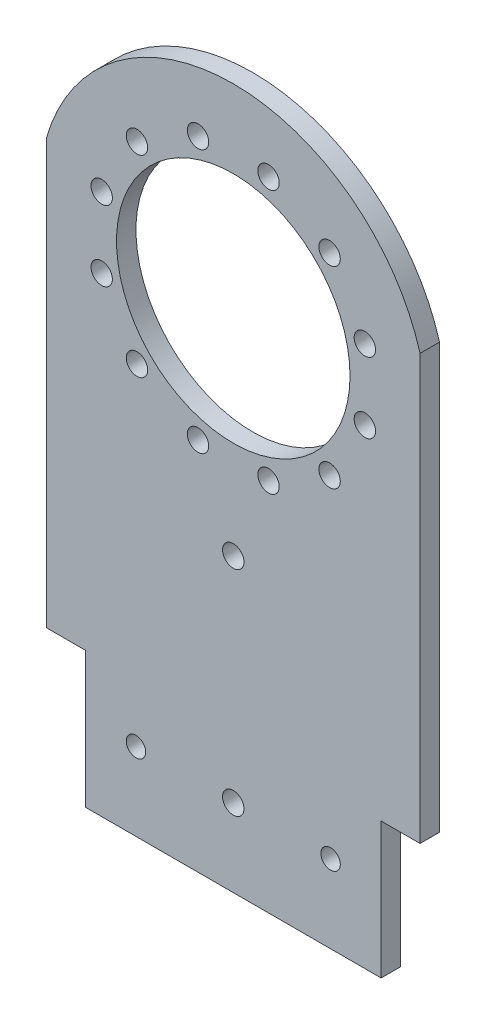
ISO-10303-21;
HEADER;
FILE_DESCRIPTION(('STEP AP214'),'2;1');
FILE_NAME('part.step','',(''),(''),'','','');
FILE_SCHEMA(('AUTOMOTIVE_DESIGN { 1 0 10303 214 1 1 1 1 }'));
ENDSEC;
DATA;
#1=APPLICATION_CONTEXT('core data for automotive mechanical design processes');
#2=APPLICATION_PROTOCOL_DEFINITION('international standard','automotive_design',2000,#1);
#3=PRODUCT_CONTEXT('',#1,'mechanical');
#4=PRODUCT('Part','Part','',(#3));
#5=PRODUCT_RELATED_PRODUCT_CATEGORY('part','',(#4));
#6=PRODUCT_DEFINITION_FORMATION('','',#4);
#7=PRODUCT_DEFINITION_CONTEXT('part definition',#1,'design');
#8=PRODUCT_DEFINITION('design','',#6,#7);
#9=PRODUCT_DEFINITION_SHAPE('','',#8);
#10=(LENGTH_UNIT() NAMED_UNIT(*) SI_UNIT(.MILLI.,.METRE.));
#11=(NAMED_UNIT(*) PLANE_ANGLE_UNIT() SI_UNIT($,.RADIAN.));
#12=(NAMED_UNIT(*) SI_UNIT($,.STERADIAN.) SOLID_ANGLE_UNIT());
#13=UNCERTAINTY_MEASURE_WITH_UNIT(LENGTH_MEASURE(1.E-05),#10,'distance_accuracy_value','');
#14=(GEOMETRIC_REPRESENTATION_CONTEXT(3) GLOBAL_UNCERTAINTY_ASSIGNED_CONTEXT((#13)) GLOBAL_UNIT_ASSIGNED_CONTEXT((#10,
#11,#12)) REPRESENTATION_CONTEXT('',''));
#15=CARTESIAN_POINT('',(0.,0.,0.));
#16=DIRECTION('',(0.,0.,1.));
#17=DIRECTION('',(1.,0.,0.));
#18=AXIS2_PLACEMENT_3D('',#15,#16,#17);
#19=CARTESIAN_POINT('',(-48.,0.,5.));
#20=DIRECTION('',(0.,1.,0.));
#21=DIRECTION('',(0.,0.,1.));
#22=AXIS2_PLACEMENT_3D('',#19,#20,#21);
#23=PLANE('',#22);
#24=DIRECTION('',(0.,0.,1.));
#25=VECTOR('',#24,1.);
#26=CARTESIAN_POINT('',(38.,0.,-83.6427217395513));
#27=LINE('',#26,#25);
#28=CARTESIAN_POINT('',(38.,0.,0.));
#29=VERTEX_POINT('',#28);
#30=CARTESIAN_POINT('',(38.,0.,5.));
#31=VERTEX_POINT('',#30);
#32=EDGE_CURVE('E60',#29,#31,#27,.T.);
#33=ORIENTED_EDGE('',*,*,#32,.F.);
#34=DIRECTION('',(1.,0.,0.));
#35=VECTOR('',#34,1.);
#36=CARTESIAN_POINT('',(-48.,0.,0.));
#37=LINE('',#36,#35);
#38=CARTESIAN_POINT('',(48.,0.,0.));
#39=VERTEX_POINT('',#38);
#40=EDGE_CURVE('E209',#29,#39,#37,.T.);
#41=ORIENTED_EDGE('',*,*,#40,.T.);
#42=DIRECTION('',(0.,0.,-1.));
#43=VECTOR('',#42,1.);
#44=CARTESIAN_POINT('',(48.,0.,5.));
#45=LINE('',#44,#43);
#46=CARTESIAN_POINT('',(48.,0.,5.));
#47=VERTEX_POINT('',#46);
#48=EDGE_CURVE('E202',#47,#39,#45,.T.);
#49=ORIENTED_EDGE('',*,*,#48,.F.);
#50=DIRECTION('',(1.,0.,0.));
#51=VECTOR('',#50,1.);
#52=CARTESIAN_POINT('',(-48.,0.,5.));
#53=LINE('',#52,#51);
#54=EDGE_CURVE('E200',#31,#47,#53,.T.);
#55=ORIENTED_EDGE('',*,*,#54,.F.);
#56=EDGE_LOOP('',(#33,#41,#49,#55));
#57=FACE_BOUND('',#56,.T.);
#58=ADVANCED_FACE('F35',(#57),#23,.F.);
#59=CARTESIAN_POINT('',(0.,95.07,5.));
#60=DIRECTION('',(0.,0.,1.));
#61=DIRECTION('',(1.,0.,0.));
#62=AXIS2_PLACEMENT_3D('',#59,#60,#61);
#63=PLANE('',#62);
#64=CARTESIAN_POINT('',(24.7487373415292,119.818737341529,5.));
#65=DIRECTION('',(0.,0.,1.));
#66=DIRECTION('',(1.,0.,0.));
#67=AXIS2_PLACEMENT_3D('',#64,#65,#66);
#68=CIRCLE('',#67,2.75);
#69=CARTESIAN_POINT('',(27.4987373415292,119.818737341529,5.));
#70=VERTEX_POINT('',#69);
#71=EDGE_CURVE('E155',#70,#70,#68,.T.);
#72=ORIENTED_EDGE('',*,*,#71,.F.);
#73=EDGE_LOOP('',(#72));
#74=FACE_BOUND('',#73,.T.);
#75=CARTESIAN_POINT('',(33.8074039201174,104.128666578588,5.));
#76=DIRECTION('',(0.,0.,1.));
#77=DIRECTION('',(1.,0.,0.));
#78=AXIS2_PLACEMENT_3D('',#75,#76,#77);
#79=CIRCLE('',#78,2.75);
#80=CARTESIAN_POINT('',(36.5574039201174,104.128666578588,5.));
#81=VERTEX_POINT('',#80);
#82=EDGE_CURVE('E159',#81,#81,#79,.T.);
#83=ORIENTED_EDGE('',*,*,#82,.F.);
#84=EDGE_LOOP('',(#83));
#85=FACE_BOUND('',#84,.T.);
#86=CARTESIAN_POINT('',(33.8074039201174,86.0113334214117,5.));
#87=DIRECTION('',(0.,0.,1.));
#88=DIRECTION('',(1.,0.,0.));
#89=AXIS2_PLACEMENT_3D('',#86,#87,#88);
#90=CIRCLE('',#89,2.75);
#91=CARTESIAN_POINT('',(36.5574039201174,86.0113334214117,5.));
#92=VERTEX_POINT('',#91);
#93=EDGE_CURVE('E162',#92,#92,#90,.T.);
#94=ORIENTED_EDGE('',*,*,#93,.F.);
#95=EDGE_LOOP('',(#94));
#96=FACE_BOUND('',#95,.T.);
#97=CARTESIAN_POINT('',(24.7487373415292,70.3212626584708,5.));
#98=DIRECTION('',(0.,0.,1.));
#99=DIRECTION('',(1.,0.,0.));
#100=AXIS2_PLACEMENT_3D('',#97,#98,#99);
#101=CIRCLE('',#100,2.74999999999999);
#102=CARTESIAN_POINT('',(27.4987373415291,70.3212626584708,5.));
#103=VERTEX_POINT('',#102);
#104=EDGE_CURVE('E165',#103,#103,#101,.T.);
#105=ORIENTED_EDGE('',*,*,#104,.F.);
#106=EDGE_LOOP('',(#105));
#107=FACE_BOUND('',#106,.T.);
#108=CARTESIAN_POINT('',(9.05866657858823,61.2625960798826,5.));
#109=DIRECTION('',(0.,0.,1.));
#110=DIRECTION('',(1.,0.,0.));
#111=AXIS2_PLACEMENT_3D('',#108,#109,#110);
#112=CIRCLE('',#111,2.74999999999999);
#113=CARTESIAN_POINT('',(11.8086665785882,61.2625960798826,5.));
#114=VERTEX_POINT('',#113);
#115=EDGE_CURVE('E168',#114,#114,#112,.T.);
#116=ORIENTED_EDGE('',*,*,#115,.F.);
#117=EDGE_LOOP('',(#116));
#118=FACE_BOUND('',#117,.T.);
#119=CARTESIAN_POINT('',(-9.05866657858824,61.2625960798826,5.));
#120=DIRECTION('',(0.,0.,1.));
#121=DIRECTION('',(1.,0.,0.));
#122=AXIS2_PLACEMENT_3D('',#119,#120,#121);
#123=CIRCLE('',#122,2.75);
#124=CARTESIAN_POINT('',(-6.30866657858825,61.2625960798826,5.));
#125=VERTEX_POINT('',#124);
#126=EDGE_CURVE('E171',#125,#125,#123,.T.);
#127=ORIENTED_EDGE('',*,*,#126,.F.);
#128=EDGE_LOOP('',(#127));
#129=FACE_BOUND('',#128,.T.);
#130=CARTESIAN_POINT('',(-24.7487373415292,70.3212626584708,5.));
#131=DIRECTION('',(0.,0.,1.));
#132=DIRECTION('',(1.,0.,0.));
#133=AXIS2_PLACEMENT_3D('',#130,#131,#132);
#134=CIRCLE('',#133,2.75);
#135=CARTESIAN_POINT('',(-21.9987373415292,70.3212626584708,5.));
#136=VERTEX_POINT('',#135);
#137=EDGE_CURVE('E174',#136,#136,#134,.T.);
#138=ORIENTED_EDGE('',*,*,#137,.F.);
#139=EDGE_LOOP('',(#138));
#140=FACE_BOUND('',#139,.T.);
#141=CARTESIAN_POINT('',(-33.8074039201174,86.0113334214118,5.));
#142=DIRECTION('',(0.,0.,1.));
#143=DIRECTION('',(1.,0.,0.));
#144=AXIS2_PLACEMENT_3D('',#141,#142,#143);
#145=CIRCLE('',#144,2.74999999999999);
#146=CARTESIAN_POINT('',(-31.0574039201174,86.0113334214118,5.));
#147=VERTEX_POINT('',#146);
#148=EDGE_CURVE('E148',#147,#147,#145,.T.);
#149=ORIENTED_EDGE('',*,*,#148,.F.);
#150=EDGE_LOOP('',(#149));
#151=FACE_BOUND('',#150,.T.);
#152=CARTESIAN_POINT('',(-33.8074039201174,104.128666578588,5.));
#153=DIRECTION('',(0.,0.,1.));
#154=DIRECTION('',(1.,0.,0.));
#155=AXIS2_PLACEMENT_3D('',#152,#153,#154);
#156=CIRCLE('',#155,2.75);
#157=CARTESIAN_POINT('',(-31.0574039201174,104.128666578588,5.));
#158=VERTEX_POINT('',#157);
#159=EDGE_CURVE('E145',#158,#158,#156,.T.);
#160=ORIENTED_EDGE('',*,*,#159,.F.);
#161=EDGE_LOOP('',(#160));
#162=FACE_BOUND('',#161,.T.);
#163=CARTESIAN_POINT('',(-24.7487373415292,119.818737341529,5.));
#164=DIRECTION('',(0.,0.,1.));
#165=DIRECTION('',(1.,0.,0.));
#166=AXIS2_PLACEMENT_3D('',#163,#164,#165);
#167=CIRCLE('',#166,2.74999999999999);
#168=CARTESIAN_POINT('',(-21.9987373415292,119.818737341529,5.));
#169=VERTEX_POINT('',#168);
#170=EDGE_CURVE('E149',#169,#169,#167,.T.);
#171=ORIENTED_EDGE('',*,*,#170,.F.);
#172=EDGE_LOOP('',(#171));
#173=FACE_BOUND('',#172,.T.);
#174=CARTESIAN_POINT('',(-9.05866657858823,128.877403920117,5.));
#175=DIRECTION('',(0.,0.,1.));
#176=DIRECTION('',(1.,0.,0.));
#177=AXIS2_PLACEMENT_3D('',#174,#175,#176);
#178=CIRCLE('',#177,2.75);
#179=CARTESIAN_POINT('',(-6.30866657858823,128.877403920117,5.));
#180=VERTEX_POINT('',#179);
#181=EDGE_CURVE('E152',#180,#180,#178,.T.);
#182=ORIENTED_EDGE('',*,*,#181,.F.);
#183=EDGE_LOOP('',(#182));
#184=FACE_BOUND('',#183,.T.);
#185=CARTESIAN_POINT('',(9.05866657858825,128.877403920117,5.));
#186=DIRECTION('',(0.,0.,1.));
#187=DIRECTION('',(1.,0.,0.));
#188=AXIS2_PLACEMENT_3D('',#185,#186,#187);
#189=CIRCLE('',#188,2.75);
#190=CARTESIAN_POINT('',(11.8086665785882,128.877403920117,5.));
#191=VERTEX_POINT('',#190);
#192=EDGE_CURVE('E158',#191,#191,#189,.T.);
#193=ORIENTED_EDGE('',*,*,#192,.F.);
#194=EDGE_LOOP('',(#193));
#195=FACE_BOUND('',#194,.T.);
#196=CARTESIAN_POINT('',(0.,40.,5.));
#197=DIRECTION('',(0.,0.,1.));
#198=DIRECTION('',(1.,0.,0.));
#199=AXIS2_PLACEMENT_3D('',#196,#197,#198);
#200=CIRCLE('',#199,2.75);
#201=CARTESIAN_POINT('',(2.75,40.,5.));
#202=VERTEX_POINT('',#201);
#203=EDGE_CURVE('E182',#202,#202,#200,.T.);
#204=ORIENTED_EDGE('',*,*,#203,.F.);
#205=EDGE_LOOP('',(#204));
#206=FACE_BOUND('',#205,.T.);
#207=DIRECTION('',(0.,1.,0.));
#208=VECTOR('',#207,1.);
#209=CARTESIAN_POINT('',(48.,109.07,5.));
#210=LINE('',#209,#208);
#211=CARTESIAN_POINT('',(48.,109.07,5.));
#212=VERTEX_POINT('',#211);
#213=EDGE_CURVE('E193',#47,#212,#210,.T.);
#214=ORIENTED_EDGE('',*,*,#213,.T.);
#215=CARTESIAN_POINT('',(0.,95.07,5.));
#216=DIRECTION('',(0.,0.,1.));
#217=DIRECTION('',(1.,0.,0.));
#218=AXIS2_PLACEMENT_3D('',#215,#216,#217);
#219=CIRCLE('',#218,50.);
#220=CARTESIAN_POINT('',(-48.,109.07,5.));
#221=VERTEX_POINT('',#220);
#222=EDGE_CURVE('E195',#212,#221,#219,.T.);
#223=ORIENTED_EDGE('',*,*,#222,.T.);
#224=DIRECTION('',(0.,-1.,0.));
#225=VECTOR('',#224,1.);
#226=CARTESIAN_POINT('',(-48.,109.07,5.));
#227=LINE('',#226,#225);
#228=CARTESIAN_POINT('',(-48.,0.,5.));
#229=VERTEX_POINT('',#228);
#230=EDGE_CURVE('E198',#221,#229,#227,.T.);
#231=ORIENTED_EDGE('',*,*,#230,.T.);
#232=CARTESIAN_POINT('',(-38.,0.,5.));
#233=VERTEX_POINT('',#232);
#234=EDGE_CURVE('E127',#229,#233,#53,.T.);
#235=ORIENTED_EDGE('',*,*,#234,.T.);
#236=DIRECTION('',(0.,-1.,0.));
#237=VECTOR('',#236,1.);
#238=CARTESIAN_POINT('',(-38.,0.,5.));
#239=LINE('',#238,#237);
#240=CARTESIAN_POINT('',(-38.,-34.93,5.));
#241=VERTEX_POINT('',#240);
#242=EDGE_CURVE('E108',#233,#241,#239,.T.);
#243=ORIENTED_EDGE('',*,*,#242,.T.);
#244=DIRECTION('',(1.,0.,0.));
#245=VECTOR('',#244,1.);
#246=CARTESIAN_POINT('',(-38.,-34.93,5.));
#247=LINE('',#246,#245);
#248=CARTESIAN_POINT('',(38.,-34.93,5.));
#249=VERTEX_POINT('',#248);
#250=EDGE_CURVE('E117',#241,#249,#247,.T.);
#251=ORIENTED_EDGE('',*,*,#250,.T.);
#252=DIRECTION('',(0.,1.,0.));
#253=VECTOR('',#252,1.);
#254=CARTESIAN_POINT('',(38.,0.,5.));
#255=LINE('',#254,#253);
#256=EDGE_CURVE('E114',#249,#31,#255,.T.);
#257=ORIENTED_EDGE('',*,*,#256,.T.);
#258=ORIENTED_EDGE('',*,*,#54,.T.);
#259=EDGE_LOOP('',(#214,#223,#231,#235,#243,#251,#257,#258));
#260=FACE_BOUND('',#259,.T.);
#261=CARTESIAN_POINT('',(0.,95.07,5.));
#262=DIRECTION('',(0.,0.,1.));
#263=DIRECTION('',(1.,0.,0.));
#264=AXIS2_PLACEMENT_3D('',#261,#262,#263);
#265=CIRCLE('',#264,30.);
#266=CARTESIAN_POINT('',(30.,95.07,5.));
#267=VERTEX_POINT('',#266);
#268=EDGE_CURVE('E186',#267,#267,#265,.T.);
#269=ORIENTED_EDGE('',*,*,#268,.F.);
#270=EDGE_LOOP('',(#269));
#271=FACE_BOUND('',#270,.T.);
#272=CARTESIAN_POINT('',(0.,-14.93,5.));
#273=DIRECTION('',(0.,0.,1.));
#274=DIRECTION('',(1.,0.,0.));
#275=AXIS2_PLACEMENT_3D('',#272,#273,#274);
#276=CIRCLE('',#275,2.75);
#277=CARTESIAN_POINT('',(2.75000000000001,-14.93,5.));
#278=VERTEX_POINT('',#277);
#279=EDGE_CURVE('E309',#278,#278,#276,.T.);
#280=ORIENTED_EDGE('',*,*,#279,.F.);
#281=EDGE_LOOP('',(#280));
#282=FACE_BOUND('',#281,.T.);
#283=CARTESIAN_POINT('',(-25.,-14.93,5.));
#284=DIRECTION('',(0.,0.,1.));
#285=DIRECTION('',(-1.,0.,0.));
#286=AXIS2_PLACEMENT_3D('',#283,#284,#285);
#287=CIRCLE('',#286,2.5);
#288=CARTESIAN_POINT('',(-27.5,-14.93,5.));
#289=VERTEX_POINT('',#288);
#290=EDGE_CURVE('E131',#289,#289,#287,.T.);
#291=ORIENTED_EDGE('',*,*,#290,.F.);
#292=EDGE_LOOP('',(#291));
#293=FACE_BOUND('',#292,.T.);
#294=CARTESIAN_POINT('',(25.,-14.93,5.));
#295=DIRECTION('',(0.,0.,1.));
#296=DIRECTION('',(1.,0.,0.));
#297=AXIS2_PLACEMENT_3D('',#294,#295,#296);
#298=CIRCLE('',#297,2.5);
#299=CARTESIAN_POINT('',(27.5,-14.93,5.));
#300=VERTEX_POINT('',#299);
#301=EDGE_CURVE('E128',#300,#300,#298,.T.);
#302=ORIENTED_EDGE('',*,*,#301,.F.);
#303=EDGE_LOOP('',(#302));
#304=FACE_BOUND('',#303,.T.);
#305=ADVANCED_FACE('F125',(#74,#85,#96,#107,#118,#129,#140,#151,#162,#173,#184,#195,#206,#260,
#271,#282,#293,#304),#63,.T.);
#306=CARTESIAN_POINT('',(0.,95.07,0.));
#307=DIRECTION('',(0.,0.,1.));
#308=DIRECTION('',(1.,0.,0.));
#309=AXIS2_PLACEMENT_3D('',#306,#307,#308);
#310=PLANE('',#309);
#311=CARTESIAN_POINT('',(24.7487373415292,119.818737341529,0.));
#312=DIRECTION('',(0.,0.,1.));
#313=DIRECTION('',(1.,0.,0.));
#314=AXIS2_PLACEMENT_3D('',#311,#312,#313);
#315=CIRCLE('',#314,2.75);
#316=CARTESIAN_POINT('',(27.4987373415292,119.818737341529,0.));
#317=VERTEX_POINT('',#316);
#318=EDGE_CURVE('E39',#317,#317,#315,.T.);
#319=ORIENTED_EDGE('',*,*,#318,.T.);
#320=EDGE_LOOP('',(#319));
#321=FACE_BOUND('',#320,.T.);
#322=CARTESIAN_POINT('',(33.8074039201174,104.128666578588,0.));
#323=DIRECTION('',(0.,0.,1.));
#324=DIRECTION('',(1.,0.,0.));
#325=AXIS2_PLACEMENT_3D('',#322,#323,#324);
#326=CIRCLE('',#325,2.75);
#327=CARTESIAN_POINT('',(36.5574039201174,104.128666578588,0.));
#328=VERTEX_POINT('',#327);
#329=EDGE_CURVE('E248',#328,#328,#326,.T.);
#330=ORIENTED_EDGE('',*,*,#329,.T.);
#331=EDGE_LOOP('',(#330));
#332=FACE_BOUND('',#331,.T.);
#333=CARTESIAN_POINT('',(33.8074039201174,86.0113334214117,0.));
#334=DIRECTION('',(0.,0.,1.));
#335=DIRECTION('',(1.,0.,0.));
#336=AXIS2_PLACEMENT_3D('',#333,#334,#335);
#337=CIRCLE('',#336,2.75);
#338=CARTESIAN_POINT('',(36.5574039201174,86.0113334214117,0.));
#339=VERTEX_POINT('',#338);
#340=EDGE_CURVE('E246',#339,#339,#337,.T.);
#341=ORIENTED_EDGE('',*,*,#340,.T.);
#342=EDGE_LOOP('',(#341));
#343=FACE_BOUND('',#342,.T.);
#344=CARTESIAN_POINT('',(24.7487373415292,70.3212626584708,0.));
#345=DIRECTION('',(0.,0.,1.));
#346=DIRECTION('',(1.,0.,0.));
#347=AXIS2_PLACEMENT_3D('',#344,#345,#346);
#348=CIRCLE('',#347,2.74999999999999);
#349=CARTESIAN_POINT('',(27.4987373415291,70.3212626584708,0.));
#350=VERTEX_POINT('',#349);
#351=EDGE_CURVE('E243',#350,#350,#348,.T.);
#352=ORIENTED_EDGE('',*,*,#351,.T.);
#353=EDGE_LOOP('',(#352));
#354=FACE_BOUND('',#353,.T.);
#355=CARTESIAN_POINT('',(9.05866657858823,61.2625960798826,0.));
#356=DIRECTION('',(0.,0.,1.));
#357=DIRECTION('',(1.,0.,0.));
#358=AXIS2_PLACEMENT_3D('',#355,#356,#357);
#359=CIRCLE('',#358,2.74999999999999);
#360=CARTESIAN_POINT('',(11.8086665785882,61.2625960798826,0.));
#361=VERTEX_POINT('',#360);
#362=EDGE_CURVE('E240',#361,#361,#359,.T.);
#363=ORIENTED_EDGE('',*,*,#362,.T.);
#364=EDGE_LOOP('',(#363));
#365=FACE_BOUND('',#364,.T.);
#366=CARTESIAN_POINT('',(-9.05866657858824,61.2625960798826,0.));
#367=DIRECTION('',(0.,0.,1.));
#368=DIRECTION('',(1.,0.,0.));
#369=AXIS2_PLACEMENT_3D('',#366,#367,#368);
#370=CIRCLE('',#369,2.75);
#371=CARTESIAN_POINT('',(-6.30866657858825,61.2625960798826,0.));
#372=VERTEX_POINT('',#371);
#373=EDGE_CURVE('E237',#372,#372,#370,.T.);
#374=ORIENTED_EDGE('',*,*,#373,.T.);
#375=EDGE_LOOP('',(#374));
#376=FACE_BOUND('',#375,.T.);
#377=CARTESIAN_POINT('',(-24.7487373415292,70.3212626584708,0.));
#378=DIRECTION('',(0.,0.,1.));
#379=DIRECTION('',(1.,0.,0.));
#380=AXIS2_PLACEMENT_3D('',#377,#378,#379);
#381=CIRCLE('',#380,2.75);
#382=CARTESIAN_POINT('',(-21.9987373415292,70.3212626584708,0.));
#383=VERTEX_POINT('',#382);
#384=EDGE_CURVE('E234',#383,#383,#381,.T.);
#385=ORIENTED_EDGE('',*,*,#384,.T.);
#386=EDGE_LOOP('',(#385));
#387=FACE_BOUND('',#386,.T.);
#388=CARTESIAN_POINT('',(-33.8074039201174,86.0113334214118,0.));
#389=DIRECTION('',(0.,0.,1.));
#390=DIRECTION('',(1.,0.,0.));
#391=AXIS2_PLACEMENT_3D('',#388,#389,#390);
#392=CIRCLE('',#391,2.74999999999999);
#393=CARTESIAN_POINT('',(-31.0574039201174,86.0113334214118,0.));
#394=VERTEX_POINT('',#393);
#395=EDGE_CURVE('E231',#394,#394,#392,.T.);
#396=ORIENTED_EDGE('',*,*,#395,.T.);
#397=EDGE_LOOP('',(#396));
#398=FACE_BOUND('',#397,.T.);
#399=CARTESIAN_POINT('',(-33.8074039201174,104.128666578588,0.));
#400=DIRECTION('',(0.,0.,1.));
#401=DIRECTION('',(1.,0.,0.));
#402=AXIS2_PLACEMENT_3D('',#399,#400,#401);
#403=CIRCLE('',#402,2.75);
#404=CARTESIAN_POINT('',(-31.0574039201174,104.128666578588,0.));
#405=VERTEX_POINT('',#404);
#406=EDGE_CURVE('E228',#405,#405,#403,.T.);
#407=ORIENTED_EDGE('',*,*,#406,.T.);
#408=EDGE_LOOP('',(#407));
#409=FACE_BOUND('',#408,.T.);
#410=CARTESIAN_POINT('',(-24.7487373415292,119.818737341529,0.));
#411=DIRECTION('',(0.,0.,1.));
#412=DIRECTION('',(1.,0.,0.));
#413=AXIS2_PLACEMENT_3D('',#410,#411,#412);
#414=CIRCLE('',#413,2.74999999999999);
#415=CARTESIAN_POINT('',(-21.9987373415292,119.818737341529,0.));
#416=VERTEX_POINT('',#415);
#417=EDGE_CURVE('E225',#416,#416,#414,.T.);
#418=ORIENTED_EDGE('',*,*,#417,.T.);
#419=EDGE_LOOP('',(#418));
#420=FACE_BOUND('',#419,.T.);
#421=CARTESIAN_POINT('',(-9.05866657858823,128.877403920117,0.));
#422=DIRECTION('',(0.,0.,1.));
#423=DIRECTION('',(1.,0.,0.));
#424=AXIS2_PLACEMENT_3D('',#421,#422,#423);
#425=CIRCLE('',#424,2.75);
#426=CARTESIAN_POINT('',(-6.30866657858823,128.877403920117,0.));
#427=VERTEX_POINT('',#426);
#428=EDGE_CURVE('E222',#427,#427,#425,.T.);
#429=ORIENTED_EDGE('',*,*,#428,.T.);
#430=EDGE_LOOP('',(#429));
#431=FACE_BOUND('',#430,.T.);
#432=CARTESIAN_POINT('',(9.05866657858825,128.877403920117,0.));
#433=DIRECTION('',(0.,0.,1.));
#434=DIRECTION('',(1.,0.,0.));
#435=AXIS2_PLACEMENT_3D('',#432,#433,#434);
#436=CIRCLE('',#435,2.75);
#437=CARTESIAN_POINT('',(11.8086665785882,128.877403920117,0.));
#438=VERTEX_POINT('',#437);
#439=EDGE_CURVE('E181',#438,#438,#436,.T.);
#440=ORIENTED_EDGE('',*,*,#439,.T.);
#441=EDGE_LOOP('',(#440));
#442=FACE_BOUND('',#441,.T.);
#443=CARTESIAN_POINT('',(0.,40.,0.));
#444=DIRECTION('',(0.,0.,1.));
#445=DIRECTION('',(1.,0.,0.));
#446=AXIS2_PLACEMENT_3D('',#443,#444,#445);
#447=CIRCLE('',#446,2.75);
#448=CARTESIAN_POINT('',(2.75,40.,0.));
#449=VERTEX_POINT('',#448);
#450=EDGE_CURVE('E185',#449,#449,#447,.T.);
#451=ORIENTED_EDGE('',*,*,#450,.T.);
#452=EDGE_LOOP('',(#451));
#453=FACE_BOUND('',#452,.T.);
#454=DIRECTION('',(0.,1.,0.));
#455=VECTOR('',#454,1.);
#456=CARTESIAN_POINT('',(48.,109.07,0.));
#457=LINE('',#456,#455);
#458=CARTESIAN_POINT('',(48.,109.07,0.));
#459=VERTEX_POINT('',#458);
#460=EDGE_CURVE('E189',#39,#459,#457,.T.);
#461=ORIENTED_EDGE('',*,*,#460,.F.);
#462=ORIENTED_EDGE('',*,*,#40,.F.);
#463=DIRECTION('',(0.,-1.,0.));
#464=VECTOR('',#463,1.);
#465=CARTESIAN_POINT('',(38.,0.,0.));
#466=LINE('',#465,#464);
#467=CARTESIAN_POINT('',(38.,-34.93,0.));
#468=VERTEX_POINT('',#467);
#469=EDGE_CURVE('E137',#29,#468,#466,.T.);
#470=ORIENTED_EDGE('',*,*,#469,.T.);
#471=DIRECTION('',(-1.,0.,0.));
#472=VECTOR('',#471,1.);
#473=CARTESIAN_POINT('',(-38.,-34.93,0.));
#474=LINE('',#473,#472);
#475=CARTESIAN_POINT('',(-38.,-34.93,0.));
#476=VERTEX_POINT('',#475);
#477=EDGE_CURVE('E304',#468,#476,#474,.T.);
#478=ORIENTED_EDGE('',*,*,#477,.T.);
#479=DIRECTION('',(0.,1.,0.));
#480=VECTOR('',#479,1.);
#481=CARTESIAN_POINT('',(-38.,0.,0.));
#482=LINE('',#481,#480);
#483=CARTESIAN_POINT('',(-38.,0.,0.));
#484=VERTEX_POINT('',#483);
#485=EDGE_CURVE('E110',#476,#484,#482,.T.);
#486=ORIENTED_EDGE('',*,*,#485,.T.);
#487=CARTESIAN_POINT('',(-48.,0.,0.));
#488=VERTEX_POINT('',#487);
#489=EDGE_CURVE('E196',#488,#484,#37,.T.);
#490=ORIENTED_EDGE('',*,*,#489,.F.);
#491=DIRECTION('',(0.,-1.,0.));
#492=VECTOR('',#491,1.);
#493=CARTESIAN_POINT('',(-48.,109.07,0.));
#494=LINE('',#493,#492);
#495=CARTESIAN_POINT('',(-48.,109.07,0.));
#496=VERTEX_POINT('',#495);
#497=EDGE_CURVE('E207',#496,#488,#494,.T.);
#498=ORIENTED_EDGE('',*,*,#497,.F.);
#499=CARTESIAN_POINT('',(0.,95.07,0.));
#500=DIRECTION('',(0.,0.,1.));
#501=DIRECTION('',(1.,0.,0.));
#502=AXIS2_PLACEMENT_3D('',#499,#500,#501);
#503=CIRCLE('',#502,50.);
#504=EDGE_CURVE('E205',#459,#496,#503,.T.);
#505=ORIENTED_EDGE('',*,*,#504,.F.);
#506=EDGE_LOOP('',(#461,#462,#470,#478,#486,#490,#498,#505));
#507=FACE_BOUND('',#506,.T.);
#508=CARTESIAN_POINT('',(0.,95.07,0.));
#509=DIRECTION('',(0.,0.,1.));
#510=DIRECTION('',(1.,0.,0.));
#511=AXIS2_PLACEMENT_3D('',#508,#509,#510);
#512=CIRCLE('',#511,30.);
#513=CARTESIAN_POINT('',(30.,95.07,0.));
#514=VERTEX_POINT('',#513);
#515=EDGE_CURVE('E190',#514,#514,#512,.T.);
#516=ORIENTED_EDGE('',*,*,#515,.T.);
#517=EDGE_LOOP('',(#516));
#518=FACE_BOUND('',#517,.T.);
#519=CARTESIAN_POINT('',(-25.,-14.93,0.));
#520=DIRECTION('',(0.,0.,1.));
#521=DIRECTION('',(1.,0.,0.));
#522=AXIS2_PLACEMENT_3D('',#519,#520,#521);
#523=CIRCLE('',#522,2.5);
#524=CARTESIAN_POINT('',(-22.5,-14.93,0.));
#525=VERTEX_POINT('',#524);
#526=EDGE_CURVE('E144',#525,#525,#523,.F.);
#527=ORIENTED_EDGE('',*,*,#526,.F.);
#528=EDGE_LOOP('',(#527));
#529=FACE_BOUND('',#528,.T.);
#530=CARTESIAN_POINT('',(0.,-14.93,0.));
#531=DIRECTION('',(0.,0.,1.));
#532=DIRECTION('',(1.,0.,0.));
#533=AXIS2_PLACEMENT_3D('',#530,#531,#532);
#534=CIRCLE('',#533,2.75);
#535=CARTESIAN_POINT('',(2.75000000000001,-14.93,0.));
#536=VERTEX_POINT('',#535);
#537=EDGE_CURVE('E140',#536,#536,#534,.F.);
#538=ORIENTED_EDGE('',*,*,#537,.F.);
#539=EDGE_LOOP('',(#538));
#540=FACE_BOUND('',#539,.T.);
#541=CARTESIAN_POINT('',(25.,-14.93,0.));
#542=DIRECTION('',(0.,0.,1.));
#543=DIRECTION('',(1.,0.,0.));
#544=AXIS2_PLACEMENT_3D('',#541,#542,#543);
#545=CIRCLE('',#544,2.5);
#546=CARTESIAN_POINT('',(27.5,-14.93,0.));
#547=VERTEX_POINT('',#546);
#548=EDGE_CURVE('E143',#547,#547,#545,.F.);
#549=ORIENTED_EDGE('',*,*,#548,.F.);
#550=EDGE_LOOP('',(#549));
#551=FACE_BOUND('',#550,.T.);
#552=ADVANCED_FACE('F255',(#321,#332,#343,#354,#365,#376,#387,#398,#409,#420,#431,#442,#453,
#507,#518,#529,#540,#551),#310,.F.);
#553=CARTESIAN_POINT('',(48.,109.07,5.));
#554=DIRECTION('',(-1.,0.,0.));
#555=DIRECTION('',(0.,-1.,0.));
#556=AXIS2_PLACEMENT_3D('',#553,#554,#555);
#557=PLANE('',#556);
#558=ORIENTED_EDGE('',*,*,#460,.T.);
#559=DIRECTION('',(0.,0.,-1.));
#560=VECTOR('',#559,1.);
#561=CARTESIAN_POINT('',(48.,109.07,5.));
#562=LINE('',#561,#560);
#563=EDGE_CURVE('E11',#212,#459,#562,.T.);
#564=ORIENTED_EDGE('',*,*,#563,.F.);
#565=ORIENTED_EDGE('',*,*,#213,.F.);
#566=ORIENTED_EDGE('',*,*,#48,.T.);
#567=EDGE_LOOP('',(#558,#564,#565,#566));
#568=FACE_BOUND('',#567,.T.);
#569=ADVANCED_FACE('F37',(#568),#557,.F.);
#570=CARTESIAN_POINT('',(0.,95.07,5.));
#571=DIRECTION('',(0.,0.,-1.));
#572=DIRECTION('',(-1.,0.,0.));
#573=AXIS2_PLACEMENT_3D('',#570,#571,#572);
#574=CYLINDRICAL_SURFACE('',#573,50.);
#575=ORIENTED_EDGE('',*,*,#504,.T.);
#576=DIRECTION('',(0.,0.,-1.));
#577=VECTOR('',#576,1.);
#578=CARTESIAN_POINT('',(-48.,109.07,5.));
#579=LINE('',#578,#577);
#580=EDGE_CURVE('E44',#221,#496,#579,.T.);
#581=ORIENTED_EDGE('',*,*,#580,.F.);
#582=ORIENTED_EDGE('',*,*,#222,.F.);
#583=ORIENTED_EDGE('',*,*,#563,.T.);
#584=EDGE_LOOP('',(#575,#581,#582,#583));
#585=FACE_BOUND('',#584,.T.);
#586=ADVANCED_FACE('F296',(#585),#574,.T.);
#587=CARTESIAN_POINT('',(-48.,109.07,5.));
#588=DIRECTION('',(1.,0.,0.));
#589=DIRECTION('',(0.,1.,0.));
#590=AXIS2_PLACEMENT_3D('',#587,#588,#589);
#591=PLANE('',#590);
#592=ORIENTED_EDGE('',*,*,#497,.T.);
#593=DIRECTION('',(0.,0.,-1.));
#594=VECTOR('',#593,1.);
#595=CARTESIAN_POINT('',(-48.,0.,5.));
#596=LINE('',#595,#594);
#597=EDGE_CURVE('E213',#229,#488,#596,.T.);
#598=ORIENTED_EDGE('',*,*,#597,.F.);
#599=ORIENTED_EDGE('',*,*,#230,.F.);
#600=ORIENTED_EDGE('',*,*,#580,.T.);
#601=EDGE_LOOP('',(#592,#598,#599,#600));
#602=FACE_BOUND('',#601,.T.);
#603=ADVANCED_FACE('F286',(#602),#591,.F.);
#604=ORIENTED_EDGE('',*,*,#489,.T.);
#605=DIRECTION('',(0.,0.,1.));
#606=VECTOR('',#605,1.);
#607=CARTESIAN_POINT('',(-38.,0.,-83.6427217395513));
#608=LINE('',#607,#606);
#609=EDGE_CURVE('E52',#484,#233,#608,.T.);
#610=ORIENTED_EDGE('',*,*,#609,.T.);
#611=ORIENTED_EDGE('',*,*,#234,.F.);
#612=ORIENTED_EDGE('',*,*,#597,.T.);
#613=EDGE_LOOP('',(#604,#610,#611,#612));
#614=FACE_BOUND('',#613,.T.);
#615=ADVANCED_FACE('F275',(#614),#23,.F.);
#616=CARTESIAN_POINT('',(0.,95.07,5.));
#617=DIRECTION('',(0.,0.,-1.));
#618=DIRECTION('',(-1.,0.,0.));
#619=AXIS2_PLACEMENT_3D('',#616,#617,#618);
#620=CYLINDRICAL_SURFACE('',#619,30.);
#621=ORIENTED_EDGE('',*,*,#268,.T.);
#622=EDGE_LOOP('',(#621));
#623=FACE_BOUND('',#622,.T.);
#624=ORIENTED_EDGE('',*,*,#515,.F.);
#625=EDGE_LOOP('',(#624));
#626=FACE_BOUND('',#625,.T.);
#627=ADVANCED_FACE('F285',(#623,#626),#620,.F.);
#628=CARTESIAN_POINT('',(0.,40.,-15.));
#629=DIRECTION('',(0.,0.,1.));
#630=DIRECTION('',(1.,0.,0.));
#631=AXIS2_PLACEMENT_3D('',#628,#629,#630);
#632=CYLINDRICAL_SURFACE('',#631,2.75);
#633=ORIENTED_EDGE('',*,*,#203,.T.);
#634=EDGE_LOOP('',(#633));
#635=FACE_BOUND('',#634,.T.);
#636=ORIENTED_EDGE('',*,*,#450,.F.);
#637=EDGE_LOOP('',(#636));
#638=FACE_BOUND('',#637,.T.);
#639=ADVANCED_FACE('F292',(#635,#638),#632,.F.);
#640=CARTESIAN_POINT('',(9.05866657858825,128.877403920117,-5.));
#641=DIRECTION('',(0.,0.,1.));
#642=DIRECTION('',(1.,0.,0.));
#643=AXIS2_PLACEMENT_3D('',#640,#641,#642);
#644=CYLINDRICAL_SURFACE('',#643,2.75);
#645=ORIENTED_EDGE('',*,*,#192,.T.);
#646=EDGE_LOOP('',(#645));
#647=FACE_BOUND('',#646,.T.);
#648=ORIENTED_EDGE('',*,*,#439,.F.);
#649=EDGE_LOOP('',(#648));
#650=FACE_BOUND('',#649,.T.);
#651=ADVANCED_FACE('F347',(#647,#650),#644,.F.);
#652=CARTESIAN_POINT('',(-9.05866657858823,128.877403920117,-5.));
#653=DIRECTION('',(0.,0.,1.));
#654=DIRECTION('',(1.,0.,0.));
#655=AXIS2_PLACEMENT_3D('',#652,#653,#654);
#656=CYLINDRICAL_SURFACE('',#655,2.75);
#657=ORIENTED_EDGE('',*,*,#181,.T.);
#658=EDGE_LOOP('',(#657));
#659=FACE_BOUND('',#658,.T.);
#660=ORIENTED_EDGE('',*,*,#428,.F.);
#661=EDGE_LOOP('',(#660));
#662=FACE_BOUND('',#661,.T.);
#663=ADVANCED_FACE('F344',(#659,#662),#656,.F.);
#664=CARTESIAN_POINT('',(-24.7487373415292,119.818737341529,-5.));
#665=DIRECTION('',(0.,0.,1.));
#666=DIRECTION('',(1.,0.,0.));
#667=AXIS2_PLACEMENT_3D('',#664,#665,#666);
#668=CYLINDRICAL_SURFACE('',#667,2.74999999999999);
#669=ORIENTED_EDGE('',*,*,#170,.T.);
#670=EDGE_LOOP('',(#669));
#671=FACE_BOUND('',#670,.T.);
#672=ORIENTED_EDGE('',*,*,#417,.F.);
#673=EDGE_LOOP('',(#672));
#674=FACE_BOUND('',#673,.T.);
#675=ADVANCED_FACE('F341',(#671,#674),#668,.F.);
#676=CARTESIAN_POINT('',(-33.8074039201174,104.128666578588,-5.));
#677=DIRECTION('',(0.,0.,1.));
#678=DIRECTION('',(1.,0.,0.));
#679=AXIS2_PLACEMENT_3D('',#676,#677,#678);
#680=CYLINDRICAL_SURFACE('',#679,2.75);
#681=ORIENTED_EDGE('',*,*,#159,.T.);
#682=EDGE_LOOP('',(#681));
#683=FACE_BOUND('',#682,.T.);
#684=ORIENTED_EDGE('',*,*,#406,.F.);
#685=EDGE_LOOP('',(#684));
#686=FACE_BOUND('',#685,.T.);
#687=ADVANCED_FACE('F337',(#683,#686),#680,.F.);
#688=CARTESIAN_POINT('',(-33.8074039201174,86.0113334214118,-5.));
#689=DIRECTION('',(0.,0.,1.));
#690=DIRECTION('',(1.,0.,0.));
#691=AXIS2_PLACEMENT_3D('',#688,#689,#690);
#692=CYLINDRICAL_SURFACE('',#691,2.74999999999999);
#693=ORIENTED_EDGE('',*,*,#148,.T.);
#694=EDGE_LOOP('',(#693));
#695=FACE_BOUND('',#694,.T.);
#696=ORIENTED_EDGE('',*,*,#395,.F.);
#697=EDGE_LOOP('',(#696));
#698=FACE_BOUND('',#697,.T.);
#699=ADVANCED_FACE('F340',(#695,#698),#692,.F.);
#700=CARTESIAN_POINT('',(-24.7487373415292,70.3212626584708,-5.));
#701=DIRECTION('',(0.,0.,1.));
#702=DIRECTION('',(1.,0.,0.));
#703=AXIS2_PLACEMENT_3D('',#700,#701,#702);
#704=CYLINDRICAL_SURFACE('',#703,2.75);
#705=ORIENTED_EDGE('',*,*,#137,.T.);
#706=EDGE_LOOP('',(#705));
#707=FACE_BOUND('',#706,.T.);
#708=ORIENTED_EDGE('',*,*,#384,.F.);
#709=EDGE_LOOP('',(#708));
#710=FACE_BOUND('',#709,.T.);
#711=ADVANCED_FACE('F372',(#707,#710),#704,.F.);
#712=CARTESIAN_POINT('',(-9.05866657858824,61.2625960798826,-5.));
#713=DIRECTION('',(0.,0.,1.));
#714=DIRECTION('',(1.,0.,0.));
#715=AXIS2_PLACEMENT_3D('',#712,#713,#714);
#716=CYLINDRICAL_SURFACE('',#715,2.75);
#717=ORIENTED_EDGE('',*,*,#126,.T.);
#718=EDGE_LOOP('',(#717));
#719=FACE_BOUND('',#718,.T.);
#720=ORIENTED_EDGE('',*,*,#373,.F.);
#721=EDGE_LOOP('',(#720));
#722=FACE_BOUND('',#721,.T.);
#723=ADVANCED_FACE('F376',(#719,#722),#716,.F.);
#724=CARTESIAN_POINT('',(9.05866657858823,61.2625960798826,-5.));
#725=DIRECTION('',(0.,0.,1.));
#726=DIRECTION('',(1.,0.,0.));
#727=AXIS2_PLACEMENT_3D('',#724,#725,#726);
#728=CYLINDRICAL_SURFACE('',#727,2.74999999999999);
#729=ORIENTED_EDGE('',*,*,#115,.T.);
#730=EDGE_LOOP('',(#729));
#731=FACE_BOUND('',#730,.T.);
#732=ORIENTED_EDGE('',*,*,#362,.F.);
#733=EDGE_LOOP('',(#732));
#734=FACE_BOUND('',#733,.T.);
#735=ADVANCED_FACE('F380',(#731,#734),#728,.F.);
#736=CARTESIAN_POINT('',(24.7487373415292,70.3212626584708,-5.));
#737=DIRECTION('',(0.,0.,1.));
#738=DIRECTION('',(1.,0.,0.));
#739=AXIS2_PLACEMENT_3D('',#736,#737,#738);
#740=CYLINDRICAL_SURFACE('',#739,2.74999999999999);
#741=ORIENTED_EDGE('',*,*,#104,.T.);
#742=EDGE_LOOP('',(#741));
#743=FACE_BOUND('',#742,.T.);
#744=ORIENTED_EDGE('',*,*,#351,.F.);
#745=EDGE_LOOP('',(#744));
#746=FACE_BOUND('',#745,.T.);
#747=ADVANCED_FACE('F384',(#743,#746),#740,.F.);
#748=CARTESIAN_POINT('',(33.8074039201174,86.0113334214117,-5.));
#749=DIRECTION('',(0.,0.,1.));
#750=DIRECTION('',(1.,0.,0.));
#751=AXIS2_PLACEMENT_3D('',#748,#749,#750);
#752=CYLINDRICAL_SURFACE('',#751,2.75);
#753=ORIENTED_EDGE('',*,*,#93,.T.);
#754=EDGE_LOOP('',(#753));
#755=FACE_BOUND('',#754,.T.);
#756=ORIENTED_EDGE('',*,*,#340,.F.);
#757=EDGE_LOOP('',(#756));
#758=FACE_BOUND('',#757,.T.);
#759=ADVANCED_FACE('F269',(#755,#758),#752,.F.);
#760=CARTESIAN_POINT('',(33.8074039201174,104.128666578588,-5.));
#761=DIRECTION('',(0.,0.,1.));
#762=DIRECTION('',(1.,0.,0.));
#763=AXIS2_PLACEMENT_3D('',#760,#761,#762);
#764=CYLINDRICAL_SURFACE('',#763,2.75);
#765=ORIENTED_EDGE('',*,*,#82,.T.);
#766=EDGE_LOOP('',(#765));
#767=FACE_BOUND('',#766,.T.);
#768=ORIENTED_EDGE('',*,*,#329,.F.);
#769=EDGE_LOOP('',(#768));
#770=FACE_BOUND('',#769,.T.);
#771=ADVANCED_FACE('F259',(#767,#770),#764,.F.);
#772=CARTESIAN_POINT('',(24.7487373415292,119.818737341529,-5.));
#773=DIRECTION('',(0.,0.,1.));
#774=DIRECTION('',(1.,0.,0.));
#775=AXIS2_PLACEMENT_3D('',#772,#773,#774);
#776=CYLINDRICAL_SURFACE('',#775,2.75);
#777=ORIENTED_EDGE('',*,*,#71,.T.);
#778=EDGE_LOOP('',(#777));
#779=FACE_BOUND('',#778,.T.);
#780=ORIENTED_EDGE('',*,*,#318,.F.);
#781=EDGE_LOOP('',(#780));
#782=FACE_BOUND('',#781,.T.);
#783=ADVANCED_FACE('F257',(#779,#782),#776,.F.);
#784=CARTESIAN_POINT('',(-38.,-34.93,-83.6427217395513));
#785=DIRECTION('',(0.,-1.,0.));
#786=DIRECTION('',(1.,0.,0.));
#787=AXIS2_PLACEMENT_3D('',#784,#785,#786);
#788=PLANE('',#787);
#789=ORIENTED_EDGE('',*,*,#477,.F.);
#790=DIRECTION('',(0.,0.,1.));
#791=VECTOR('',#790,1.);
#792=CARTESIAN_POINT('',(38.,-34.93,-83.6427217395513));
#793=LINE('',#792,#791);
#794=EDGE_CURVE('E113',#468,#249,#793,.T.);
#795=ORIENTED_EDGE('',*,*,#794,.T.);
#796=ORIENTED_EDGE('',*,*,#250,.F.);
#797=DIRECTION('',(0.,0.,1.));
#798=VECTOR('',#797,1.);
#799=CARTESIAN_POINT('',(-38.,-34.93,-83.6427217395513));
#800=LINE('',#799,#798);
#801=EDGE_CURVE('E104',#476,#241,#800,.T.);
#802=ORIENTED_EDGE('',*,*,#801,.F.);
#803=EDGE_LOOP('',(#789,#795,#796,#802));
#804=FACE_BOUND('',#803,.T.);
#805=ADVANCED_FACE('F118',(#804),#788,.T.);
#806=CARTESIAN_POINT('',(38.,0.,-83.6427217395513));
#807=DIRECTION('',(1.,0.,0.));
#808=DIRECTION('',(0.,1.,0.));
#809=AXIS2_PLACEMENT_3D('',#806,#807,#808);
#810=PLANE('',#809);
#811=ORIENTED_EDGE('',*,*,#469,.F.);
#812=ORIENTED_EDGE('',*,*,#32,.T.);
#813=ORIENTED_EDGE('',*,*,#256,.F.);
#814=ORIENTED_EDGE('',*,*,#794,.F.);
#815=EDGE_LOOP('',(#811,#812,#813,#814));
#816=FACE_BOUND('',#815,.T.);
#817=ADVANCED_FACE('F267',(#816),#810,.T.);
#818=CARTESIAN_POINT('',(-38.,0.,-83.6427217395513));
#819=DIRECTION('',(-1.,0.,0.));
#820=DIRECTION('',(0.,0.,1.));
#821=AXIS2_PLACEMENT_3D('',#818,#819,#820);
#822=PLANE('',#821);
#823=ORIENTED_EDGE('',*,*,#485,.F.);
#824=ORIENTED_EDGE('',*,*,#801,.T.);
#825=ORIENTED_EDGE('',*,*,#242,.F.);
#826=ORIENTED_EDGE('',*,*,#609,.F.);
#827=EDGE_LOOP('',(#823,#824,#825,#826));
#828=FACE_BOUND('',#827,.T.);
#829=ADVANCED_FACE('F106',(#828),#822,.T.);
#830=CARTESIAN_POINT('',(25.,-14.93,-83.6427217395513));
#831=DIRECTION('',(0.,0.,1.));
#832=DIRECTION('',(1.,0.,0.));
#833=AXIS2_PLACEMENT_3D('',#830,#831,#832);
#834=CYLINDRICAL_SURFACE('',#833,2.5);
#835=ORIENTED_EDGE('',*,*,#548,.T.);
#836=EDGE_LOOP('',(#835));
#837=FACE_BOUND('',#836,.T.);
#838=ORIENTED_EDGE('',*,*,#301,.T.);
#839=EDGE_LOOP('',(#838));
#840=FACE_BOUND('',#839,.T.);
#841=ADVANCED_FACE('F319',(#837,#840),#834,.F.);
#842=CARTESIAN_POINT('',(-25.,-14.93,-83.6427217395513));
#843=DIRECTION('',(0.,0.,1.));
#844=DIRECTION('',(1.,0.,0.));
#845=AXIS2_PLACEMENT_3D('',#842,#843,#844);
#846=CYLINDRICAL_SURFACE('',#845,2.5);
#847=ORIENTED_EDGE('',*,*,#526,.T.);
#848=EDGE_LOOP('',(#847));
#849=FACE_BOUND('',#848,.T.);
#850=ORIENTED_EDGE('',*,*,#290,.T.);
#851=EDGE_LOOP('',(#850));
#852=FACE_BOUND('',#851,.T.);
#853=ADVANCED_FACE('F314',(#849,#852),#846,.F.);
#854=CARTESIAN_POINT('',(0.,-14.93,-83.6427217395513));
#855=DIRECTION('',(0.,0.,1.));
#856=DIRECTION('',(1.,0.,0.));
#857=AXIS2_PLACEMENT_3D('',#854,#855,#856);
#858=CYLINDRICAL_SURFACE('',#857,2.75);
#859=ORIENTED_EDGE('',*,*,#537,.T.);
#860=EDGE_LOOP('',(#859));
#861=FACE_BOUND('',#860,.T.);
#862=ORIENTED_EDGE('',*,*,#279,.T.);
#863=EDGE_LOOP('',(#862));
#864=FACE_BOUND('',#863,.T.);
#865=ADVANCED_FACE('F327',(#861,#864),#858,.F.);
#866=CLOSED_SHELL('',(#58,#305,#552,#569,#586,#603,#615,#627,#639,#651,#663,#675,#687,#699,#711,
#723,#735,#747,#759,#771,#783,#805,#817,#829,#841,#853,#865));
#867=MANIFOLD_SOLID_BREP('B2',#866);
#868=ADVANCED_BREP_SHAPE_REPRESENTATION('',(#18,#867),#14);
#869=SHAPE_DEFINITION_REPRESENTATION(#9,#868);
ENDSEC;
END-ISO-10303-21;
